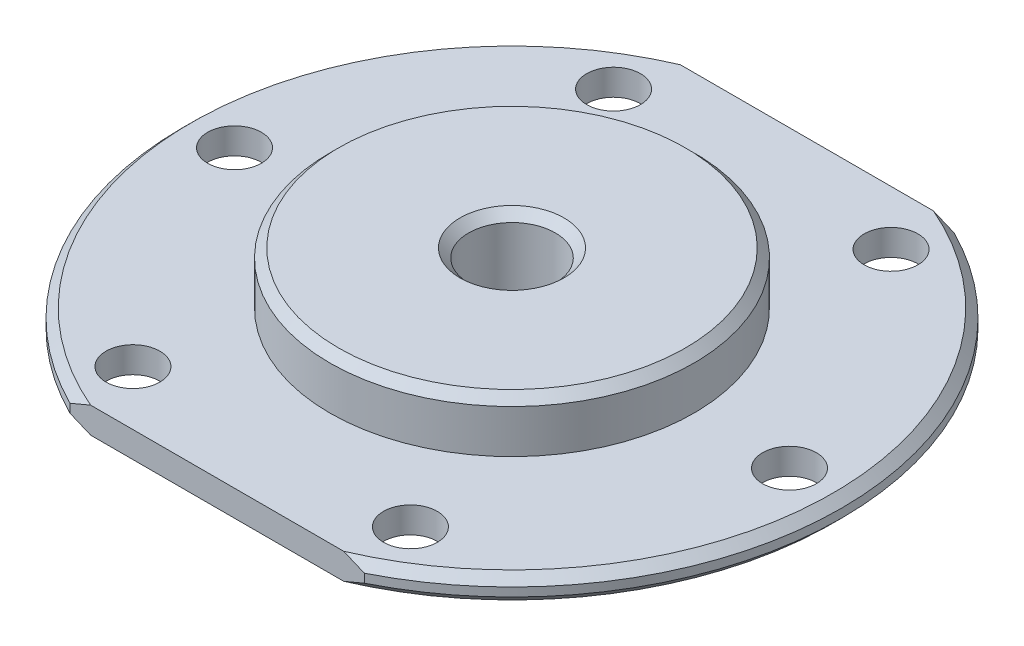
ISO-10303-21;
HEADER;
FILE_DESCRIPTION(('STEP AP214'),'2;1');
FILE_NAME('part.step','',(''),(''),'','','');
FILE_SCHEMA(('AUTOMOTIVE_DESIGN { 1 0 10303 214 1 1 1 1 }'));
ENDSEC;
DATA;
#1=APPLICATION_CONTEXT('core data for automotive mechanical design processes');
#2=APPLICATION_PROTOCOL_DEFINITION('international standard','automotive_design',2000,#1);
#3=PRODUCT_CONTEXT('',#1,'mechanical');
#4=PRODUCT('Part','Part','',(#3));
#5=PRODUCT_RELATED_PRODUCT_CATEGORY('part','',(#4));
#6=PRODUCT_DEFINITION_FORMATION('','',#4);
#7=PRODUCT_DEFINITION_CONTEXT('part definition',#1,'design');
#8=PRODUCT_DEFINITION('design','',#6,#7);
#9=PRODUCT_DEFINITION_SHAPE('','',#8);
#10=(LENGTH_UNIT() NAMED_UNIT(*) SI_UNIT(.MILLI.,.METRE.));
#11=(NAMED_UNIT(*) PLANE_ANGLE_UNIT() SI_UNIT($,.RADIAN.));
#12=(NAMED_UNIT(*) SI_UNIT($,.STERADIAN.) SOLID_ANGLE_UNIT());
#13=UNCERTAINTY_MEASURE_WITH_UNIT(LENGTH_MEASURE(1.E-05),#10,'distance_accuracy_value','');
#14=(GEOMETRIC_REPRESENTATION_CONTEXT(3) GLOBAL_UNCERTAINTY_ASSIGNED_CONTEXT((#13)) GLOBAL_UNIT_ASSIGNED_CONTEXT((#10,
#11,#12)) REPRESENTATION_CONTEXT('',''));
#15=CARTESIAN_POINT('',(0.,0.,0.));
#16=DIRECTION('',(0.,0.,1.));
#17=DIRECTION('',(1.,0.,0.));
#18=AXIS2_PLACEMENT_3D('',#15,#16,#17);
#19=CARTESIAN_POINT('',(0.,1.5,0.));
#20=DIRECTION('',(0.,1.,0.));
#21=DIRECTION('',(0.,0.,1.));
#22=AXIS2_PLACEMENT_3D('',#19,#20,#21);
#23=PLANE('',#22);
#24=CARTESIAN_POINT('',(0.,1.5,0.));
#25=DIRECTION('',(0.,1.,0.));
#26=DIRECTION('',(0.,0.,1.));
#27=AXIS2_PLACEMENT_3D('',#24,#25,#26);
#28=CIRCLE('',#27,10.5);
#29=CARTESIAN_POINT('',(0.,1.5,10.5));
#30=VERTEX_POINT('',#29);
#31=EDGE_CURVE('E368',#30,#30,#28,.T.);
#32=ORIENTED_EDGE('',*,*,#31,.F.);
#33=EDGE_LOOP('',(#32));
#34=FACE_BOUND('',#33,.T.);
#35=CARTESIAN_POINT('',(7.99999999999987,1.5,13.8564064605511));
#36=DIRECTION('',(0.,1.,0.));
#37=DIRECTION('',(0.,0.,1.));
#38=AXIS2_PLACEMENT_3D('',#35,#36,#37);
#39=CIRCLE('',#38,1.55);
#40=CARTESIAN_POINT('',(7.99999999999987,1.5,15.4064064605511));
#41=VERTEX_POINT('',#40);
#42=EDGE_CURVE('E398',#41,#41,#39,.T.);
#43=ORIENTED_EDGE('',*,*,#42,.F.);
#44=EDGE_LOOP('',(#43));
#45=FACE_BOUND('',#44,.T.);
#46=CARTESIAN_POINT('',(8.00000000000007,1.5,-13.856406460551));
#47=DIRECTION('',(0.,1.,0.));
#48=DIRECTION('',(0.,0.,1.));
#49=AXIS2_PLACEMENT_3D('',#46,#47,#48);
#50=CIRCLE('',#49,1.55);
#51=CARTESIAN_POINT('',(8.00000000000007,1.5,-12.306406460551));
#52=VERTEX_POINT('',#51);
#53=EDGE_CURVE('E386',#52,#52,#50,.T.);
#54=ORIENTED_EDGE('',*,*,#53,.F.);
#55=EDGE_LOOP('',(#54));
#56=FACE_BOUND('',#55,.T.);
#57=CARTESIAN_POINT('',(-16.,1.5,0.));
#58=DIRECTION('',(0.,1.,0.));
#59=DIRECTION('',(0.,0.,1.));
#60=AXIS2_PLACEMENT_3D('',#57,#58,#59);
#61=CIRCLE('',#60,1.55);
#62=CARTESIAN_POINT('',(-16.,1.5,1.55));
#63=VERTEX_POINT('',#62);
#64=EDGE_CURVE('E374',#63,#63,#61,.T.);
#65=ORIENTED_EDGE('',*,*,#64,.F.);
#66=EDGE_LOOP('',(#65));
#67=FACE_BOUND('',#66,.T.);
#68=DIRECTION('',(1.,0.,0.));
#69=VECTOR('',#68,1.);
#70=CARTESIAN_POINT('',(-8.48528137423856,1.5,17.));
#71=LINE('',#70,#69);
#72=CARTESIAN_POINT('',(-7.2972597596632,1.5,17.));
#73=VERTEX_POINT('',#72);
#74=CARTESIAN_POINT('',(7.2972597596632,1.5,17.));
#75=VERTEX_POINT('',#74);
#76=EDGE_CURVE('E229',#73,#75,#71,.T.);
#77=ORIENTED_EDGE('',*,*,#76,.T.);
#78=CARTESIAN_POINT('',(0.,1.5,0.));
#79=DIRECTION('',(0.,1.,0.));
#80=DIRECTION('',(0.,0.,1.));
#81=AXIS2_PLACEMENT_3D('',#78,#79,#80);
#82=CIRCLE('',#81,18.5);
#83=CARTESIAN_POINT('',(7.2972597596632,1.5,-17.));
#84=VERTEX_POINT('',#83);
#85=EDGE_CURVE('E235',#75,#84,#82,.T.);
#86=ORIENTED_EDGE('',*,*,#85,.T.);
#87=DIRECTION('',(-1.,0.,0.));
#88=VECTOR('',#87,1.);
#89=CARTESIAN_POINT('',(-8.48528137423856,1.5,-17.));
#90=LINE('',#89,#88);
#91=CARTESIAN_POINT('',(-7.2972597596632,1.5,-17.));
#92=VERTEX_POINT('',#91);
#93=EDGE_CURVE('E108',#84,#92,#90,.T.);
#94=ORIENTED_EDGE('',*,*,#93,.T.);
#95=CARTESIAN_POINT('',(0.,1.5,0.));
#96=DIRECTION('',(0.,1.,0.));
#97=DIRECTION('',(0.,0.,1.));
#98=AXIS2_PLACEMENT_3D('',#95,#96,#97);
#99=CIRCLE('',#98,18.5);
#100=EDGE_CURVE('E233',#92,#73,#99,.T.);
#101=ORIENTED_EDGE('',*,*,#100,.T.);
#102=EDGE_LOOP('',(#77,#86,#94,#101));
#103=FACE_BOUND('',#102,.T.);
#104=CARTESIAN_POINT('',(-7.99999999999997,1.5,-13.856406460551));
#105=DIRECTION('',(0.,1.,0.));
#106=DIRECTION('',(0.,0.,1.));
#107=AXIS2_PLACEMENT_3D('',#104,#105,#106);
#108=CIRCLE('',#107,1.55);
#109=CARTESIAN_POINT('',(-7.99999999999997,1.5,-12.306406460551));
#110=VERTEX_POINT('',#109);
#111=EDGE_CURVE('E380',#110,#110,#108,.T.);
#112=ORIENTED_EDGE('',*,*,#111,.F.);
#113=EDGE_LOOP('',(#112));
#114=FACE_BOUND('',#113,.T.);
#115=CARTESIAN_POINT('',(16.,1.5,1.1172740284298E-13));
#116=DIRECTION('',(0.,1.,0.));
#117=DIRECTION('',(0.,0.,1.));
#118=AXIS2_PLACEMENT_3D('',#115,#116,#117);
#119=CIRCLE('',#118,1.55);
#120=CARTESIAN_POINT('',(16.,1.5,1.55000000000011));
#121=VERTEX_POINT('',#120);
#122=EDGE_CURVE('E392',#121,#121,#119,.T.);
#123=ORIENTED_EDGE('',*,*,#122,.F.);
#124=EDGE_LOOP('',(#123));
#125=FACE_BOUND('',#124,.T.);
#126=CARTESIAN_POINT('',(-8.00000000000016,1.5,13.8564064605509));
#127=DIRECTION('',(0.,1.,0.));
#128=DIRECTION('',(0.,0.,1.));
#129=AXIS2_PLACEMENT_3D('',#126,#127,#128);
#130=CIRCLE('',#129,1.55);
#131=CARTESIAN_POINT('',(-8.00000000000016,1.5,15.4064064605509));
#132=VERTEX_POINT('',#131);
#133=EDGE_CURVE('E404',#132,#132,#130,.T.);
#134=ORIENTED_EDGE('',*,*,#133,.F.);
#135=EDGE_LOOP('',(#134));
#136=FACE_BOUND('',#135,.T.);
#137=ADVANCED_FACE('F35',(#34,#45,#56,#67,#103,#114,#125,#136),#23,.T.);
#138=CARTESIAN_POINT('',(0.,0.,0.));
#139=DIRECTION('',(0.,1.,0.));
#140=DIRECTION('',(0.,0.,1.));
#141=AXIS2_PLACEMENT_3D('',#138,#139,#140);
#142=PLANE('',#141);
#143=CARTESIAN_POINT('',(0.,0.,0.));
#144=DIRECTION('',(0.,-1.,0.));
#145=DIRECTION('',(0.,0.,-1.));
#146=AXIS2_PLACEMENT_3D('',#143,#144,#145);
#147=CIRCLE('',#146,5.);
#148=CARTESIAN_POINT('',(0.,0.,-5.));
#149=VERTEX_POINT('',#148);
#150=EDGE_CURVE('E366',#149,#149,#147,.T.);
#151=ORIENTED_EDGE('',*,*,#150,.F.);
#152=EDGE_LOOP('',(#151));
#153=FACE_BOUND('',#152,.T.);
#154=DIRECTION('',(-1.,0.,0.));
#155=VECTOR('',#154,1.);
#156=CARTESIAN_POINT('',(-8.48528137423856,0.,-17.));
#157=LINE('',#156,#155);
#158=CARTESIAN_POINT('',(7.29725975966319,0.,-17.));
#159=VERTEX_POINT('',#158);
#160=CARTESIAN_POINT('',(-7.29725975966319,0.,-17.));
#161=VERTEX_POINT('',#160);
#162=EDGE_CURVE('E223',#159,#161,#157,.T.);
#163=ORIENTED_EDGE('',*,*,#162,.F.);
#164=CARTESIAN_POINT('',(0.,0.,0.));
#165=DIRECTION('',(0.,1.,0.));
#166=DIRECTION('',(0.,0.,1.));
#167=AXIS2_PLACEMENT_3D('',#164,#165,#166);
#168=CIRCLE('',#167,18.5);
#169=CARTESIAN_POINT('',(7.29725975966319,0.,17.));
#170=VERTEX_POINT('',#169);
#171=EDGE_CURVE('E217',#159,#170,#168,.F.);
#172=ORIENTED_EDGE('',*,*,#171,.T.);
#173=DIRECTION('',(1.,0.,0.));
#174=VECTOR('',#173,1.);
#175=CARTESIAN_POINT('',(-8.48528137423856,0.,17.));
#176=LINE('',#175,#174);
#177=CARTESIAN_POINT('',(-7.29725975966319,0.,17.));
#178=VERTEX_POINT('',#177);
#179=EDGE_CURVE('E230',#178,#170,#176,.T.);
#180=ORIENTED_EDGE('',*,*,#179,.F.);
#181=CARTESIAN_POINT('',(0.,0.,0.));
#182=DIRECTION('',(0.,1.,0.));
#183=DIRECTION('',(0.,0.,1.));
#184=AXIS2_PLACEMENT_3D('',#181,#182,#183);
#185=CIRCLE('',#184,18.5);
#186=EDGE_CURVE('E218',#178,#161,#185,.F.);
#187=ORIENTED_EDGE('',*,*,#186,.T.);
#188=EDGE_LOOP('',(#163,#172,#180,#187));
#189=FACE_BOUND('',#188,.T.);
#190=CARTESIAN_POINT('',(-16.,0.,0.));
#191=DIRECTION('',(0.,1.,0.));
#192=DIRECTION('',(0.,0.,1.));
#193=AXIS2_PLACEMENT_3D('',#190,#191,#192);
#194=CIRCLE('',#193,1.55);
#195=CARTESIAN_POINT('',(-16.,0.,1.55));
#196=VERTEX_POINT('',#195);
#197=EDGE_CURVE('E377',#196,#196,#194,.T.);
#198=ORIENTED_EDGE('',*,*,#197,.T.);
#199=EDGE_LOOP('',(#198));
#200=FACE_BOUND('',#199,.T.);
#201=CARTESIAN_POINT('',(-7.99999999999997,0.,-13.856406460551));
#202=DIRECTION('',(0.,1.,0.));
#203=DIRECTION('',(0.,0.,1.));
#204=AXIS2_PLACEMENT_3D('',#201,#202,#203);
#205=CIRCLE('',#204,1.55);
#206=CARTESIAN_POINT('',(-7.99999999999997,0.,-12.306406460551));
#207=VERTEX_POINT('',#206);
#208=EDGE_CURVE('E383',#207,#207,#205,.T.);
#209=ORIENTED_EDGE('',*,*,#208,.T.);
#210=EDGE_LOOP('',(#209));
#211=FACE_BOUND('',#210,.T.);
#212=CARTESIAN_POINT('',(8.00000000000007,0.,-13.856406460551));
#213=DIRECTION('',(0.,1.,0.));
#214=DIRECTION('',(0.,0.,1.));
#215=AXIS2_PLACEMENT_3D('',#212,#213,#214);
#216=CIRCLE('',#215,1.55);
#217=CARTESIAN_POINT('',(8.00000000000007,0.,-12.306406460551));
#218=VERTEX_POINT('',#217);
#219=EDGE_CURVE('E389',#218,#218,#216,.T.);
#220=ORIENTED_EDGE('',*,*,#219,.T.);
#221=EDGE_LOOP('',(#220));
#222=FACE_BOUND('',#221,.T.);
#223=CARTESIAN_POINT('',(16.,0.,1.1172740284298E-13));
#224=DIRECTION('',(0.,1.,0.));
#225=DIRECTION('',(0.,0.,1.));
#226=AXIS2_PLACEMENT_3D('',#223,#224,#225);
#227=CIRCLE('',#226,1.55);
#228=CARTESIAN_POINT('',(16.,0.,1.55000000000011));
#229=VERTEX_POINT('',#228);
#230=EDGE_CURVE('E395',#229,#229,#227,.T.);
#231=ORIENTED_EDGE('',*,*,#230,.T.);
#232=EDGE_LOOP('',(#231));
#233=FACE_BOUND('',#232,.T.);
#234=CARTESIAN_POINT('',(7.99999999999987,0.,13.8564064605511));
#235=DIRECTION('',(0.,1.,0.));
#236=DIRECTION('',(0.,0.,1.));
#237=AXIS2_PLACEMENT_3D('',#234,#235,#236);
#238=CIRCLE('',#237,1.55);
#239=CARTESIAN_POINT('',(7.99999999999987,0.,15.4064064605511));
#240=VERTEX_POINT('',#239);
#241=EDGE_CURVE('E401',#240,#240,#238,.T.);
#242=ORIENTED_EDGE('',*,*,#241,.T.);
#243=EDGE_LOOP('',(#242));
#244=FACE_BOUND('',#243,.T.);
#245=CARTESIAN_POINT('',(-8.00000000000016,0.,13.8564064605509));
#246=DIRECTION('',(0.,1.,0.));
#247=DIRECTION('',(0.,0.,1.));
#248=AXIS2_PLACEMENT_3D('',#245,#246,#247);
#249=CIRCLE('',#248,1.55);
#250=CARTESIAN_POINT('',(-8.00000000000016,0.,15.4064064605509));
#251=VERTEX_POINT('',#250);
#252=EDGE_CURVE('E407',#251,#251,#249,.T.);
#253=ORIENTED_EDGE('',*,*,#252,.T.);
#254=EDGE_LOOP('',(#253));
#255=FACE_BOUND('',#254,.T.);
#256=ADVANCED_FACE('F154',(#153,#189,#200,#211,#222,#233,#244,#255),#142,.F.);
#257=CARTESIAN_POINT('',(0.,1.5,0.));
#258=DIRECTION('',(0.,-1.,0.));
#259=DIRECTION('',(0.,0.,-1.));
#260=AXIS2_PLACEMENT_3D('',#257,#258,#259);
#261=CYLINDRICAL_SURFACE('',#260,19.);
#262=DIRECTION('',(0.,-1.,0.));
#263=VECTOR('',#262,1.);
#264=CARTESIAN_POINT('',(-8.48528137423856,1.5,-17.));
#265=LINE('',#264,#263);
#266=CARTESIAN_POINT('',(-8.48528137423856,1.,-17.));
#267=VERTEX_POINT('',#266);
#268=CARTESIAN_POINT('',(-8.48528137423856,0.5,-17.));
#269=VERTEX_POINT('',#268);
#270=EDGE_CURVE('E125',#267,#269,#265,.T.);
#271=ORIENTED_EDGE('',*,*,#270,.T.);
#272=CARTESIAN_POINT('',(0.,0.5,0.));
#273=DIRECTION('',(0.,1.,0.));
#274=DIRECTION('',(0.,0.,1.));
#275=AXIS2_PLACEMENT_3D('',#272,#273,#274);
#276=CIRCLE('',#275,19.);
#277=CARTESIAN_POINT('',(-8.48528137423856,0.5,17.));
#278=VERTEX_POINT('',#277);
#279=EDGE_CURVE('E11',#269,#278,#276,.T.);
#280=ORIENTED_EDGE('',*,*,#279,.T.);
#281=DIRECTION('',(0.,-1.,0.));
#282=VECTOR('',#281,1.);
#283=CARTESIAN_POINT('',(-8.48528137423856,1.5,17.));
#284=LINE('',#283,#282);
#285=CARTESIAN_POINT('',(-8.48528137423856,1.,17.));
#286=VERTEX_POINT('',#285);
#287=EDGE_CURVE('E244',#286,#278,#284,.T.);
#288=ORIENTED_EDGE('',*,*,#287,.F.);
#289=CARTESIAN_POINT('',(0.,1.,0.));
#290=DIRECTION('',(0.,1.,0.));
#291=DIRECTION('',(0.,0.,1.));
#292=AXIS2_PLACEMENT_3D('',#289,#290,#291);
#293=CIRCLE('',#292,19.);
#294=EDGE_CURVE('E45',#286,#267,#293,.F.);
#295=ORIENTED_EDGE('',*,*,#294,.T.);
#296=EDGE_LOOP('',(#271,#280,#288,#295));
#297=FACE_BOUND('',#296,.T.);
#298=ADVANCED_FACE('F207',(#297),#261,.T.);
#299=CARTESIAN_POINT('',(-8.48528137423856,1.5,17.));
#300=DIRECTION('',(0.,0.,-1.));
#301=DIRECTION('',(-1.,0.,0.));
#302=AXIS2_PLACEMENT_3D('',#299,#300,#301);
#303=PLANE('',#302);
#304=ORIENTED_EDGE('',*,*,#179,.T.);
#305=CARTESIAN_POINT('',(7.29725975966319,0.,17.));
#306=CARTESIAN_POINT('',(7.39719487948349,0.0394191850347754,17.));
#307=CARTESIAN_POINT('',(7.49689622621428,0.0794296704768808,17.));
#308=CARTESIAN_POINT('',(7.69582202053382,0.160584933755773,17.));
#309=CARTESIAN_POINT('',(7.79504652511085,0.201729571878801,17.));
#310=CARTESIAN_POINT('',(7.99303326311035,0.285114298994633,17.));
#311=CARTESIAN_POINT('',(8.0917954990056,0.327354382119744,17.));
#312=CARTESIAN_POINT('',(8.28887455002268,0.412894043845014,17.));
#313=CARTESIAN_POINT('',(8.38719130902524,0.456193751763,17.));
#314=CARTESIAN_POINT('',(8.48528137423856,0.499999999999986,17.));
#315=B_SPLINE_CURVE_WITH_KNOTS('',3,(#305,#306,#307,#308,#309,#310,#311,#312,#313,#314),
.UNSPECIFIED.,.F.,.F.,(4,2,2,2,4),(0.,0.322283148753815,0.644526772037856,0.966768669597235,
1.28905009200689),.UNSPECIFIED.);
#316=CARTESIAN_POINT('',(8.48528137423856,0.5,17.));
#317=VERTEX_POINT('',#316);
#318=EDGE_CURVE('E192',#170,#317,#315,.T.);
#319=ORIENTED_EDGE('',*,*,#318,.T.);
#320=DIRECTION('',(0.,-1.,0.));
#321=VECTOR('',#320,1.);
#322=CARTESIAN_POINT('',(8.48528137423856,1.5,17.));
#323=LINE('',#322,#321);
#324=CARTESIAN_POINT('',(8.48528137423856,1.,17.));
#325=VERTEX_POINT('',#324);
#326=EDGE_CURVE('E124',#325,#317,#323,.T.);
#327=ORIENTED_EDGE('',*,*,#326,.F.);
#328=CARTESIAN_POINT('',(8.48528137423856,1.,17.));
#329=CARTESIAN_POINT('',(8.38719130902524,1.043806248237,17.));
#330=CARTESIAN_POINT('',(8.28887455002269,1.08710595615498,17.));
#331=CARTESIAN_POINT('',(8.0917954990056,1.17264561788026,17.));
#332=CARTESIAN_POINT('',(7.99303326311036,1.21488570100537,17.));
#333=CARTESIAN_POINT('',(7.79504652511086,1.2982704281212,17.));
#334=CARTESIAN_POINT('',(7.69582202053382,1.33941506624422,17.));
#335=CARTESIAN_POINT('',(7.49689622621428,1.42057032952312,17.));
#336=CARTESIAN_POINT('',(7.39719487948351,1.46058081496524,17.));
#337=CARTESIAN_POINT('',(7.29725975966321,1.50000000000003,17.));
#338=B_SPLINE_CURVE_WITH_KNOTS('',3,(#328,#329,#330,#331,#332,#333,#334,#335,#336,#337),
.UNSPECIFIED.,.F.,.F.,(4,2,2,2,4),(0.,0.32228142240965,0.644523319969028,0.966766943253069,
1.28905009200688),.UNSPECIFIED.);
#339=EDGE_CURVE('E129',#325,#75,#338,.T.);
#340=ORIENTED_EDGE('',*,*,#339,.T.);
#341=ORIENTED_EDGE('',*,*,#76,.F.);
#342=CARTESIAN_POINT('',(-7.2972597596632,1.5,17.));
#343=CARTESIAN_POINT('',(-7.3971948794835,1.46058081496522,17.));
#344=CARTESIAN_POINT('',(-7.49689622621428,1.42057032952312,17.));
#345=CARTESIAN_POINT('',(-7.69582202053382,1.33941506624423,17.));
#346=CARTESIAN_POINT('',(-7.79504652511086,1.2982704281212,17.));
#347=CARTESIAN_POINT('',(-7.99303326311036,1.21488570100537,17.));
#348=CARTESIAN_POINT('',(-8.0917954990056,1.17264561788026,17.));
#349=CARTESIAN_POINT('',(-8.28887455002268,1.08710595615498,17.));
#350=CARTESIAN_POINT('',(-8.38719130902524,1.043806248237,17.));
#351=CARTESIAN_POINT('',(-8.48528137423856,1.00000000000001,17.));
#352=B_SPLINE_CURVE_WITH_KNOTS('',3,(#342,#343,#344,#345,#346,#347,#348,#349,#350,#351),
.UNSPECIFIED.,.F.,.F.,(4,2,2,2,4),(0.,0.322283148753814,0.644526772037853,0.966768669597231,
1.28905009200688),.UNSPECIFIED.);
#353=EDGE_CURVE('E59',#73,#286,#352,.T.);
#354=ORIENTED_EDGE('',*,*,#353,.T.);
#355=ORIENTED_EDGE('',*,*,#287,.T.);
#356=CARTESIAN_POINT('',(-8.48528137423856,0.5,17.));
#357=CARTESIAN_POINT('',(-8.38719130902524,0.456193751763006,17.));
#358=CARTESIAN_POINT('',(-8.28887455002268,0.412894043845016,17.));
#359=CARTESIAN_POINT('',(-8.0917954990056,0.327354382119743,17.));
#360=CARTESIAN_POINT('',(-7.99303326311036,0.285114298994633,17.));
#361=CARTESIAN_POINT('',(-7.79504652511085,0.201729571878801,17.));
#362=CARTESIAN_POINT('',(-7.69582202053382,0.160584933755774,17.));
#363=CARTESIAN_POINT('',(-7.49689622621428,0.0794296704768765,17.));
#364=CARTESIAN_POINT('',(-7.3971948794835,0.039419185034765,17.));
#365=CARTESIAN_POINT('',(-7.2972597596632,0.,17.));
#366=B_SPLINE_CURVE_WITH_KNOTS('',3,(#356,#357,#358,#359,#360,#361,#362,#363,#364,#365),
.UNSPECIFIED.,.F.,.F.,(4,2,2,2,4),(0.,0.322281422409653,0.644523319969033,0.966766943253074,
1.28905009200689),.UNSPECIFIED.);
#367=EDGE_CURVE('E52',#278,#178,#366,.T.);
#368=ORIENTED_EDGE('',*,*,#367,.T.);
#369=EDGE_LOOP('',(#304,#319,#327,#340,#341,#354,#355,#368));
#370=FACE_BOUND('',#369,.T.);
#371=ADVANCED_FACE('F203',(#370),#303,.F.);
#372=CARTESIAN_POINT('',(0.,1.5,0.));
#373=DIRECTION('',(0.,-1.,0.));
#374=DIRECTION('',(0.,0.,-1.));
#375=AXIS2_PLACEMENT_3D('',#372,#373,#374);
#376=CYLINDRICAL_SURFACE('',#375,19.);
#377=ORIENTED_EDGE('',*,*,#326,.T.);
#378=CARTESIAN_POINT('',(0.,0.5,0.));
#379=DIRECTION('',(0.,1.,0.));
#380=DIRECTION('',(0.,0.,1.));
#381=AXIS2_PLACEMENT_3D('',#378,#379,#380);
#382=CIRCLE('',#381,19.);
#383=CARTESIAN_POINT('',(8.48528137423856,0.5,-17.));
#384=VERTEX_POINT('',#383);
#385=EDGE_CURVE('E123',#317,#384,#382,.T.);
#386=ORIENTED_EDGE('',*,*,#385,.T.);
#387=DIRECTION('',(0.,-1.,0.));
#388=VECTOR('',#387,1.);
#389=CARTESIAN_POINT('',(8.48528137423856,1.5,-17.));
#390=LINE('',#389,#388);
#391=CARTESIAN_POINT('',(8.48528137423856,1.,-17.));
#392=VERTEX_POINT('',#391);
#393=EDGE_CURVE('E106',#392,#384,#390,.T.);
#394=ORIENTED_EDGE('',*,*,#393,.F.);
#395=CARTESIAN_POINT('',(0.,1.,0.));
#396=DIRECTION('',(0.,1.,0.));
#397=DIRECTION('',(0.,0.,1.));
#398=AXIS2_PLACEMENT_3D('',#395,#396,#397);
#399=CIRCLE('',#398,19.);
#400=EDGE_CURVE('E120',#392,#325,#399,.F.);
#401=ORIENTED_EDGE('',*,*,#400,.T.);
#402=EDGE_LOOP('',(#377,#386,#394,#401));
#403=FACE_BOUND('',#402,.T.);
#404=ADVANCED_FACE('F119',(#403),#376,.T.);
#405=CARTESIAN_POINT('',(-8.48528137423856,1.5,-17.));
#406=DIRECTION('',(0.,0.,1.));
#407=DIRECTION('',(1.,0.,0.));
#408=AXIS2_PLACEMENT_3D('',#405,#406,#407);
#409=PLANE('',#408);
#410=ORIENTED_EDGE('',*,*,#393,.T.);
#411=CARTESIAN_POINT('',(8.48528137423856,0.5,-17.));
#412=CARTESIAN_POINT('',(8.38719130902524,0.456193751763006,-17.));
#413=CARTESIAN_POINT('',(8.28887455002268,0.412894043845017,-17.));
#414=CARTESIAN_POINT('',(8.0917954990056,0.327354382119743,-17.));
#415=CARTESIAN_POINT('',(7.99303326311035,0.285114298994633,-17.));
#416=CARTESIAN_POINT('',(7.79504652511085,0.201729571878801,-17.));
#417=CARTESIAN_POINT('',(7.69582202053382,0.160584933755774,-17.));
#418=CARTESIAN_POINT('',(7.49689622621428,0.0794296704768766,-17.));
#419=CARTESIAN_POINT('',(7.3971948794835,0.0394191850347652,-17.));
#420=CARTESIAN_POINT('',(7.2972597596632,0.,-17.));
#421=B_SPLINE_CURVE_WITH_KNOTS('',3,(#411,#412,#413,#414,#415,#416,#417,#418,#419,#420),
.UNSPECIFIED.,.F.,.F.,(4,2,2,2,4),(0.,0.322281422409653,0.644523319969032,0.966766943253072,
1.28905009200689),.UNSPECIFIED.);
#422=EDGE_CURVE('E113',#384,#159,#421,.T.);
#423=ORIENTED_EDGE('',*,*,#422,.T.);
#424=ORIENTED_EDGE('',*,*,#162,.T.);
#425=CARTESIAN_POINT('',(-7.29725975966319,0.,-17.));
#426=CARTESIAN_POINT('',(-7.39719487948349,0.0394191850347754,-17.));
#427=CARTESIAN_POINT('',(-7.49689622621428,0.0794296704768808,-17.));
#428=CARTESIAN_POINT('',(-7.69582202053382,0.160584933755773,-17.));
#429=CARTESIAN_POINT('',(-7.79504652511085,0.201729571878801,-17.));
#430=CARTESIAN_POINT('',(-7.99303326311035,0.285114298994633,-17.));
#431=CARTESIAN_POINT('',(-8.0917954990056,0.327354382119744,-17.));
#432=CARTESIAN_POINT('',(-8.28887455002268,0.412894043845014,-17.));
#433=CARTESIAN_POINT('',(-8.38719130902524,0.456193751763,-17.));
#434=CARTESIAN_POINT('',(-8.48528137423856,0.499999999999986,-17.));
#435=B_SPLINE_CURVE_WITH_KNOTS('',3,(#425,#426,#427,#428,#429,#430,#431,#432,#433,#434),
.UNSPECIFIED.,.F.,.F.,(4,2,2,2,4),(0.,0.322283148753815,0.644526772037856,0.966768669597235,
1.28905009200689),.UNSPECIFIED.);
#436=EDGE_CURVE('E114',#161,#269,#435,.T.);
#437=ORIENTED_EDGE('',*,*,#436,.T.);
#438=ORIENTED_EDGE('',*,*,#270,.F.);
#439=CARTESIAN_POINT('',(-8.48528137423856,1.,-17.));
#440=CARTESIAN_POINT('',(-8.38719130902524,1.043806248237,-17.));
#441=CARTESIAN_POINT('',(-8.28887455002269,1.08710595615498,-17.));
#442=CARTESIAN_POINT('',(-8.0917954990056,1.17264561788026,-17.));
#443=CARTESIAN_POINT('',(-7.99303326311036,1.21488570100537,-17.));
#444=CARTESIAN_POINT('',(-7.79504652511086,1.2982704281212,-17.));
#445=CARTESIAN_POINT('',(-7.69582202053382,1.33941506624422,-17.));
#446=CARTESIAN_POINT('',(-7.49689622621428,1.42057032952312,-17.));
#447=CARTESIAN_POINT('',(-7.39719487948351,1.46058081496524,-17.));
#448=CARTESIAN_POINT('',(-7.29725975966321,1.50000000000003,-17.));
#449=B_SPLINE_CURVE_WITH_KNOTS('',3,(#439,#440,#441,#442,#443,#444,#445,#446,#447,#448),
.UNSPECIFIED.,.F.,.F.,(4,2,2,2,4),(0.,0.32228142240965,0.644523319969028,0.966766943253069,
1.28905009200688),.UNSPECIFIED.);
#450=EDGE_CURVE('E132',#267,#92,#449,.T.);
#451=ORIENTED_EDGE('',*,*,#450,.T.);
#452=ORIENTED_EDGE('',*,*,#93,.F.);
#453=CARTESIAN_POINT('',(7.2972597596632,1.5,-17.));
#454=CARTESIAN_POINT('',(7.3971948794835,1.46058081496522,-17.));
#455=CARTESIAN_POINT('',(7.49689622621428,1.42057032952312,-17.));
#456=CARTESIAN_POINT('',(7.69582202053382,1.33941506624423,-17.));
#457=CARTESIAN_POINT('',(7.79504652511086,1.2982704281212,-17.));
#458=CARTESIAN_POINT('',(7.99303326311036,1.21488570100537,-17.));
#459=CARTESIAN_POINT('',(8.0917954990056,1.17264561788026,-17.));
#460=CARTESIAN_POINT('',(8.28887455002268,1.08710595615498,-17.));
#461=CARTESIAN_POINT('',(8.38719130902524,1.043806248237,-17.));
#462=CARTESIAN_POINT('',(8.48528137423856,1.00000000000001,-17.));
#463=B_SPLINE_CURVE_WITH_KNOTS('',3,(#453,#454,#455,#456,#457,#458,#459,#460,#461,#462),
.UNSPECIFIED.,.F.,.F.,(4,2,2,2,4),(0.,0.322283148753814,0.644526772037853,0.966768669597231,
1.28905009200688),.UNSPECIFIED.);
#464=EDGE_CURVE('E103',#84,#392,#463,.T.);
#465=ORIENTED_EDGE('',*,*,#464,.T.);
#466=EDGE_LOOP('',(#410,#423,#424,#437,#438,#451,#452,#465));
#467=FACE_BOUND('',#466,.T.);
#468=ADVANCED_FACE('F105',(#467),#409,.F.);
#469=CARTESIAN_POINT('',(-16.,1.5,0.));
#470=DIRECTION('',(0.,-1.,0.));
#471=DIRECTION('',(0.,0.,-1.));
#472=AXIS2_PLACEMENT_3D('',#469,#470,#471);
#473=CYLINDRICAL_SURFACE('',#472,1.55);
#474=ORIENTED_EDGE('',*,*,#64,.T.);
#475=EDGE_LOOP('',(#474));
#476=FACE_BOUND('',#475,.T.);
#477=ORIENTED_EDGE('',*,*,#197,.F.);
#478=EDGE_LOOP('',(#477));
#479=FACE_BOUND('',#478,.T.);
#480=ADVANCED_FACE('F153',(#476,#479),#473,.F.);
#481=CARTESIAN_POINT('',(-7.99999999999997,1.5,-13.856406460551));
#482=DIRECTION('',(0.,-1.,0.));
#483=DIRECTION('',(0.,0.,-1.));
#484=AXIS2_PLACEMENT_3D('',#481,#482,#483);
#485=CYLINDRICAL_SURFACE('',#484,1.55);
#486=ORIENTED_EDGE('',*,*,#111,.T.);
#487=EDGE_LOOP('',(#486));
#488=FACE_BOUND('',#487,.T.);
#489=ORIENTED_EDGE('',*,*,#208,.F.);
#490=EDGE_LOOP('',(#489));
#491=FACE_BOUND('',#490,.T.);
#492=ADVANCED_FACE('F263',(#488,#491),#485,.F.);
#493=CARTESIAN_POINT('',(8.00000000000007,1.5,-13.856406460551));
#494=DIRECTION('',(0.,-1.,0.));
#495=DIRECTION('',(0.,0.,-1.));
#496=AXIS2_PLACEMENT_3D('',#493,#494,#495);
#497=CYLINDRICAL_SURFACE('',#496,1.55);
#498=ORIENTED_EDGE('',*,*,#53,.T.);
#499=EDGE_LOOP('',(#498));
#500=FACE_BOUND('',#499,.T.);
#501=ORIENTED_EDGE('',*,*,#219,.F.);
#502=EDGE_LOOP('',(#501));
#503=FACE_BOUND('',#502,.T.);
#504=ADVANCED_FACE('F267',(#500,#503),#497,.F.);
#505=CARTESIAN_POINT('',(16.,1.5,1.1172740284298E-13));
#506=DIRECTION('',(0.,-1.,0.));
#507=DIRECTION('',(0.,0.,-1.));
#508=AXIS2_PLACEMENT_3D('',#505,#506,#507);
#509=CYLINDRICAL_SURFACE('',#508,1.55);
#510=ORIENTED_EDGE('',*,*,#122,.T.);
#511=EDGE_LOOP('',(#510));
#512=FACE_BOUND('',#511,.T.);
#513=ORIENTED_EDGE('',*,*,#230,.F.);
#514=EDGE_LOOP('',(#513));
#515=FACE_BOUND('',#514,.T.);
#516=ADVANCED_FACE('F271',(#512,#515),#509,.F.);
#517=CARTESIAN_POINT('',(7.99999999999987,1.5,13.8564064605511));
#518=DIRECTION('',(0.,-1.,0.));
#519=DIRECTION('',(0.,0.,-1.));
#520=AXIS2_PLACEMENT_3D('',#517,#518,#519);
#521=CYLINDRICAL_SURFACE('',#520,1.55);
#522=ORIENTED_EDGE('',*,*,#42,.T.);
#523=EDGE_LOOP('',(#522));
#524=FACE_BOUND('',#523,.T.);
#525=ORIENTED_EDGE('',*,*,#241,.F.);
#526=EDGE_LOOP('',(#525));
#527=FACE_BOUND('',#526,.T.);
#528=ADVANCED_FACE('F275',(#524,#527),#521,.F.);
#529=CARTESIAN_POINT('',(-8.00000000000016,1.5,13.8564064605509));
#530=DIRECTION('',(0.,-1.,0.));
#531=DIRECTION('',(0.,0.,-1.));
#532=AXIS2_PLACEMENT_3D('',#529,#530,#531);
#533=CYLINDRICAL_SURFACE('',#532,1.55);
#534=ORIENTED_EDGE('',*,*,#133,.T.);
#535=EDGE_LOOP('',(#534));
#536=FACE_BOUND('',#535,.T.);
#537=ORIENTED_EDGE('',*,*,#252,.F.);
#538=EDGE_LOOP('',(#537));
#539=FACE_BOUND('',#538,.T.);
#540=ADVANCED_FACE('F279',(#536,#539),#533,.F.);
#541=CARTESIAN_POINT('',(0.,4.5,0.));
#542=DIRECTION('',(0.,-1.,0.));
#543=DIRECTION('',(0.,0.,-1.));
#544=AXIS2_PLACEMENT_3D('',#541,#542,#543);
#545=CYLINDRICAL_SURFACE('',#544,10.5);
#546=CARTESIAN_POINT('',(0.,4.,0.));
#547=DIRECTION('',(0.,1.,0.));
#548=DIRECTION('',(0.,0.,1.));
#549=AXIS2_PLACEMENT_3D('',#546,#547,#548);
#550=CIRCLE('',#549,10.5);
#551=CARTESIAN_POINT('',(0.,4.,10.5));
#552=VERTEX_POINT('',#551);
#553=EDGE_CURVE('E130',#552,#552,#550,.F.);
#554=ORIENTED_EDGE('',*,*,#553,.T.);
#555=EDGE_LOOP('',(#554));
#556=FACE_BOUND('',#555,.T.);
#557=ORIENTED_EDGE('',*,*,#31,.T.);
#558=EDGE_LOOP('',(#557));
#559=FACE_BOUND('',#558,.T.);
#560=ADVANCED_FACE('F283',(#556,#559),#545,.T.);
#561=CARTESIAN_POINT('',(0.,4.5,0.));
#562=DIRECTION('',(0.,1.,0.));
#563=DIRECTION('',(0.,0.,1.));
#564=AXIS2_PLACEMENT_3D('',#561,#562,#563);
#565=PLANE('',#564);
#566=CARTESIAN_POINT('',(0.,4.5,0.));
#567=DIRECTION('',(0.,1.,0.));
#568=DIRECTION('',(0.,0.,1.));
#569=AXIS2_PLACEMENT_3D('',#566,#567,#568);
#570=CIRCLE('',#569,3.00000000000002);
#571=CARTESIAN_POINT('',(0.,4.5,3.00000000000002));
#572=VERTEX_POINT('',#571);
#573=EDGE_CURVE('E135',#572,#572,#570,.F.);
#574=ORIENTED_EDGE('',*,*,#573,.T.);
#575=EDGE_LOOP('',(#574));
#576=FACE_BOUND('',#575,.T.);
#577=CARTESIAN_POINT('',(0.,4.5,0.));
#578=DIRECTION('',(0.,1.,0.));
#579=DIRECTION('',(0.,0.,1.));
#580=AXIS2_PLACEMENT_3D('',#577,#578,#579);
#581=CIRCLE('',#580,9.99999999999999);
#582=CARTESIAN_POINT('',(0.,4.5,9.99999999999999));
#583=VERTEX_POINT('',#582);
#584=EDGE_CURVE('E328',#583,#583,#581,.T.);
#585=ORIENTED_EDGE('',*,*,#584,.T.);
#586=EDGE_LOOP('',(#585));
#587=FACE_BOUND('',#586,.T.);
#588=ADVANCED_FACE('F287',(#576,#587),#565,.T.);
#589=CARTESIAN_POINT('',(0.,-5.,0.));
#590=DIRECTION('',(0.,1.,0.));
#591=DIRECTION('',(0.,0.,1.));
#592=AXIS2_PLACEMENT_3D('',#589,#590,#591);
#593=CYLINDRICAL_SURFACE('',#592,5.);
#594=CARTESIAN_POINT('',(0.,-4.5,0.));
#595=DIRECTION('',(0.,-1.,0.));
#596=DIRECTION('',(0.,0.,-1.));
#597=AXIS2_PLACEMENT_3D('',#594,#595,#596);
#598=CIRCLE('',#597,5.);
#599=CARTESIAN_POINT('',(0.,-4.5,-5.));
#600=VERTEX_POINT('',#599);
#601=EDGE_CURVE('E319',#600,#600,#598,.F.);
#602=ORIENTED_EDGE('',*,*,#601,.T.);
#603=EDGE_LOOP('',(#602));
#604=FACE_BOUND('',#603,.T.);
#605=ORIENTED_EDGE('',*,*,#150,.T.);
#606=EDGE_LOOP('',(#605));
#607=FACE_BOUND('',#606,.T.);
#608=ADVANCED_FACE('F291',(#604,#607),#593,.T.);
#609=CARTESIAN_POINT('',(0.,-5.,0.));
#610=DIRECTION('',(0.,-1.,0.));
#611=DIRECTION('',(0.,0.,-1.));
#612=AXIS2_PLACEMENT_3D('',#609,#610,#611);
#613=PLANE('',#612);
#614=CARTESIAN_POINT('',(0.,-5.,0.));
#615=DIRECTION('',(0.,-1.,0.));
#616=DIRECTION('',(0.,0.,-1.));
#617=AXIS2_PLACEMENT_3D('',#614,#615,#616);
#618=CIRCLE('',#617,2.99999999999999);
#619=CARTESIAN_POINT('',(0.,-5.,-2.99999999999999));
#620=VERTEX_POINT('',#619);
#621=EDGE_CURVE('E317',#620,#620,#618,.F.);
#622=ORIENTED_EDGE('',*,*,#621,.T.);
#623=EDGE_LOOP('',(#622));
#624=FACE_BOUND('',#623,.T.);
#625=CARTESIAN_POINT('',(0.,-5.,0.));
#626=DIRECTION('',(0.,-1.,0.));
#627=DIRECTION('',(0.,0.,-1.));
#628=AXIS2_PLACEMENT_3D('',#625,#626,#627);
#629=CIRCLE('',#628,4.5);
#630=CARTESIAN_POINT('',(0.,-5.,-4.5));
#631=VERTEX_POINT('',#630);
#632=EDGE_CURVE('E322',#631,#631,#629,.T.);
#633=ORIENTED_EDGE('',*,*,#632,.T.);
#634=EDGE_LOOP('',(#633));
#635=FACE_BOUND('',#634,.T.);
#636=ADVANCED_FACE('F295',(#624,#635),#613,.T.);
#637=CARTESIAN_POINT('',(0.,-5.,0.));
#638=DIRECTION('',(0.,1.,0.));
#639=DIRECTION('',(0.,0.,1.));
#640=AXIS2_PLACEMENT_3D('',#637,#638,#639);
#641=CYLINDRICAL_SURFACE('',#640,2.5);
#642=CARTESIAN_POINT('',(0.,-4.50000000000001,0.));
#643=DIRECTION('',(0.,-1.,0.));
#644=DIRECTION('',(0.,0.,-1.));
#645=AXIS2_PLACEMENT_3D('',#642,#643,#644);
#646=CIRCLE('',#645,2.5);
#647=CARTESIAN_POINT('',(0.,-4.50000000000001,-2.5));
#648=VERTEX_POINT('',#647);
#649=EDGE_CURVE('E312',#648,#648,#646,.T.);
#650=ORIENTED_EDGE('',*,*,#649,.T.);
#651=EDGE_LOOP('',(#650));
#652=FACE_BOUND('',#651,.T.);
#653=CARTESIAN_POINT('',(0.,3.99999999999999,0.));
#654=DIRECTION('',(0.,1.,0.));
#655=DIRECTION('',(0.,0.,1.));
#656=AXIS2_PLACEMENT_3D('',#653,#654,#655);
#657=CIRCLE('',#656,2.5);
#658=CARTESIAN_POINT('',(0.,3.99999999999999,2.5));
#659=VERTEX_POINT('',#658);
#660=EDGE_CURVE('E315',#659,#659,#657,.T.);
#661=ORIENTED_EDGE('',*,*,#660,.T.);
#662=EDGE_LOOP('',(#661));
#663=FACE_BOUND('',#662,.T.);
#664=ADVANCED_FACE('F299',(#652,#663),#641,.F.);
#665=CARTESIAN_POINT('',(0.,-5.,0.));
#666=DIRECTION('',(0.,-1.,0.));
#667=DIRECTION('',(0.,0.,-1.));
#668=AXIS2_PLACEMENT_3D('',#665,#666,#667);
#669=CONICAL_SURFACE('',#668,2.99999999999999,0.785398163397444);
#670=ORIENTED_EDGE('',*,*,#649,.F.);
#671=EDGE_LOOP('',(#670));
#672=FACE_BOUND('',#671,.T.);
#673=ORIENTED_EDGE('',*,*,#621,.F.);
#674=EDGE_LOOP('',(#673));
#675=FACE_BOUND('',#674,.T.);
#676=ADVANCED_FACE('F302',(#672,#675),#669,.F.);
#677=CARTESIAN_POINT('',(0.,-5.,0.));
#678=DIRECTION('',(0.,1.,0.));
#679=DIRECTION('',(0.,0.,1.));
#680=AXIS2_PLACEMENT_3D('',#677,#678,#679);
#681=CONICAL_SURFACE('',#680,4.5,0.785398163397445);
#682=ORIENTED_EDGE('',*,*,#601,.F.);
#683=EDGE_LOOP('',(#682));
#684=FACE_BOUND('',#683,.T.);
#685=ORIENTED_EDGE('',*,*,#632,.F.);
#686=EDGE_LOOP('',(#685));
#687=FACE_BOUND('',#686,.T.);
#688=ADVANCED_FACE('F307',(#684,#687),#681,.T.);
#689=CARTESIAN_POINT('',(0.,3.99999999999999,0.));
#690=DIRECTION('',(0.,1.,0.));
#691=DIRECTION('',(0.,0.,1.));
#692=AXIS2_PLACEMENT_3D('',#689,#690,#691);
#693=CONICAL_SURFACE('',#692,2.5,0.785398163397454);
#694=ORIENTED_EDGE('',*,*,#573,.F.);
#695=EDGE_LOOP('',(#694));
#696=FACE_BOUND('',#695,.T.);
#697=ORIENTED_EDGE('',*,*,#660,.F.);
#698=EDGE_LOOP('',(#697));
#699=FACE_BOUND('',#698,.T.);
#700=ADVANCED_FACE('F334',(#696,#699),#693,.F.);
#701=CARTESIAN_POINT('',(0.,4.5,0.));
#702=DIRECTION('',(0.,-1.,0.));
#703=DIRECTION('',(0.,0.,-1.));
#704=AXIS2_PLACEMENT_3D('',#701,#702,#703);
#705=CONICAL_SURFACE('',#704,9.99999999999999,0.785398163397452);
#706=ORIENTED_EDGE('',*,*,#553,.F.);
#707=EDGE_LOOP('',(#706));
#708=FACE_BOUND('',#707,.T.);
#709=ORIENTED_EDGE('',*,*,#584,.F.);
#710=EDGE_LOOP('',(#709));
#711=FACE_BOUND('',#710,.T.);
#712=ADVANCED_FACE('F336',(#708,#711),#705,.T.);
#713=CARTESIAN_POINT('',(0.,0.5,0.));
#714=DIRECTION('',(0.,1.,0.));
#715=DIRECTION('',(0.,0.,1.));
#716=AXIS2_PLACEMENT_3D('',#713,#714,#715);
#717=CONICAL_SURFACE('',#716,19.,0.785398163397452);
#718=ORIENTED_EDGE('',*,*,#318,.F.);
#719=ORIENTED_EDGE('',*,*,#171,.F.);
#720=ORIENTED_EDGE('',*,*,#422,.F.);
#721=ORIENTED_EDGE('',*,*,#385,.F.);
#722=EDGE_LOOP('',(#718,#719,#720,#721));
#723=FACE_BOUND('',#722,.T.);
#724=ADVANCED_FACE('F180',(#723),#717,.T.);
#725=CARTESIAN_POINT('',(0.,1.5,0.));
#726=DIRECTION('',(0.,-1.,0.));
#727=DIRECTION('',(0.,0.,-1.));
#728=AXIS2_PLACEMENT_3D('',#725,#726,#727);
#729=CONICAL_SURFACE('',#728,18.5,0.785398163397448);
#730=ORIENTED_EDGE('',*,*,#339,.F.);
#731=ORIENTED_EDGE('',*,*,#400,.F.);
#732=ORIENTED_EDGE('',*,*,#464,.F.);
#733=ORIENTED_EDGE('',*,*,#85,.F.);
#734=EDGE_LOOP('',(#730,#731,#732,#733));
#735=FACE_BOUND('',#734,.T.);
#736=ADVANCED_FACE('F128',(#735),#729,.T.);
#737=CARTESIAN_POINT('',(0.,0.5,0.));
#738=DIRECTION('',(0.,1.,0.));
#739=DIRECTION('',(0.,0.,1.));
#740=AXIS2_PLACEMENT_3D('',#737,#738,#739);
#741=CONICAL_SURFACE('',#740,19.,0.785398163397452);
#742=ORIENTED_EDGE('',*,*,#436,.F.);
#743=ORIENTED_EDGE('',*,*,#186,.F.);
#744=ORIENTED_EDGE('',*,*,#367,.F.);
#745=ORIENTED_EDGE('',*,*,#279,.F.);
#746=EDGE_LOOP('',(#742,#743,#744,#745));
#747=FACE_BOUND('',#746,.T.);
#748=ADVANCED_FACE('F179',(#747),#741,.T.);
#749=CARTESIAN_POINT('',(0.,1.5,0.));
#750=DIRECTION('',(0.,-1.,0.));
#751=DIRECTION('',(0.,0.,-1.));
#752=AXIS2_PLACEMENT_3D('',#749,#750,#751);
#753=CONICAL_SURFACE('',#752,18.5,0.785398163397448);
#754=ORIENTED_EDGE('',*,*,#450,.F.);
#755=ORIENTED_EDGE('',*,*,#294,.F.);
#756=ORIENTED_EDGE('',*,*,#353,.F.);
#757=ORIENTED_EDGE('',*,*,#100,.F.);
#758=EDGE_LOOP('',(#754,#755,#756,#757));
#759=FACE_BOUND('',#758,.T.);
#760=ADVANCED_FACE('F38',(#759),#753,.T.);
#761=CLOSED_SHELL('',(#137,#256,#298,#371,#404,#468,#480,#492,#504,#516,#528,#540,#560,#588,
#608,#636,#664,#676,#688,#700,#712,#724,#736,#748,#760));
#762=MANIFOLD_SOLID_BREP('B2',#761);
#763=ADVANCED_BREP_SHAPE_REPRESENTATION('',(#18,#762),#14);
#764=SHAPE_DEFINITION_REPRESENTATION(#9,#763);
ENDSEC;
END-ISO-10303-21;
